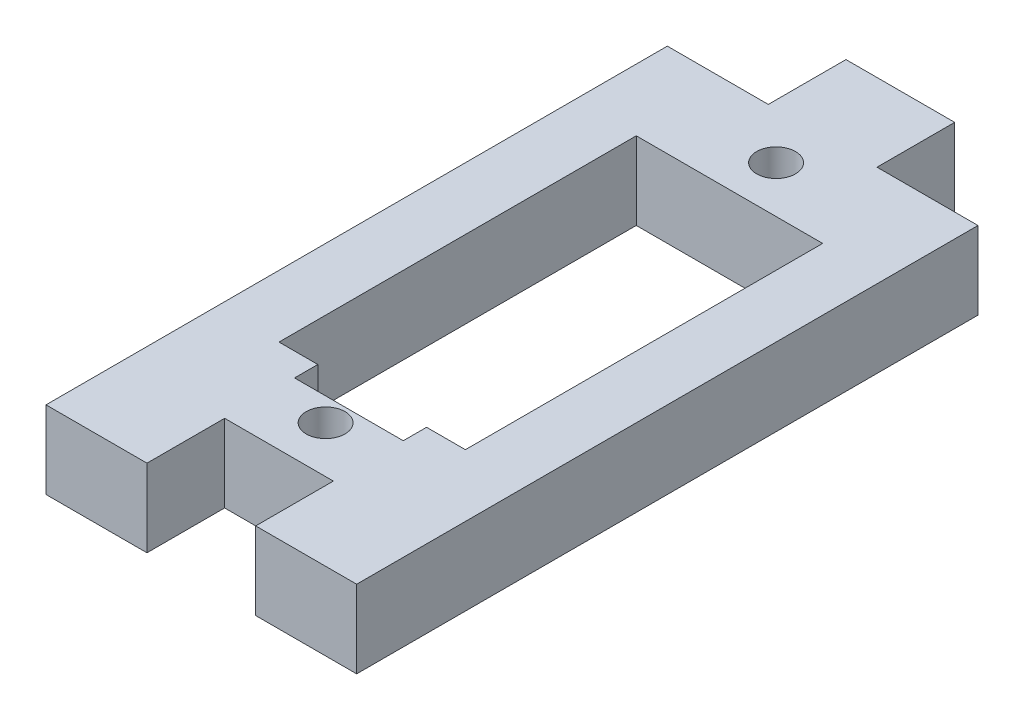
ISO-10303-21;
HEADER;
FILE_DESCRIPTION(('STEP AP214'),'2;1');
FILE_NAME('part.step','',(''),(''),'','','');
FILE_SCHEMA(('AUTOMOTIVE_DESIGN { 1 0 10303 214 1 1 1 1 }'));
ENDSEC;
DATA;
#1=APPLICATION_CONTEXT('core data for automotive mechanical design processes');
#2=APPLICATION_PROTOCOL_DEFINITION('international standard','automotive_design',2000,#1);
#3=PRODUCT_CONTEXT('',#1,'mechanical');
#4=PRODUCT('Part','Part','',(#3));
#5=PRODUCT_RELATED_PRODUCT_CATEGORY('part','',(#4));
#6=PRODUCT_DEFINITION_FORMATION('','',#4);
#7=PRODUCT_DEFINITION_CONTEXT('part definition',#1,'design');
#8=PRODUCT_DEFINITION('design','',#6,#7);
#9=PRODUCT_DEFINITION_SHAPE('','',#8);
#10=(LENGTH_UNIT() NAMED_UNIT(*) SI_UNIT(.MILLI.,.METRE.));
#11=(NAMED_UNIT(*) PLANE_ANGLE_UNIT() SI_UNIT($,.RADIAN.));
#12=(NAMED_UNIT(*) SI_UNIT($,.STERADIAN.) SOLID_ANGLE_UNIT());
#13=UNCERTAINTY_MEASURE_WITH_UNIT(LENGTH_MEASURE(1.E-05),#10,'distance_accuracy_value','');
#14=(GEOMETRIC_REPRESENTATION_CONTEXT(3) GLOBAL_UNCERTAINTY_ASSIGNED_CONTEXT((#13)) GLOBAL_UNIT_ASSIGNED_CONTEXT((#10,
#11,#12)) REPRESENTATION_CONTEXT('',''));
#15=CARTESIAN_POINT('',(0.,0.,0.));
#16=DIRECTION('',(0.,0.,1.));
#17=DIRECTION('',(1.,0.,0.));
#18=AXIS2_PLACEMENT_3D('',#15,#16,#17);
#19=CARTESIAN_POINT('',(-3.5,5.,-20.));
#20=DIRECTION('',(0.,0.,1.));
#21=DIRECTION('',(1.,0.,0.));
#22=AXIS2_PLACEMENT_3D('',#19,#20,#21);
#23=PLANE('',#22);
#24=DIRECTION('',(-1.,0.,0.));
#25=VECTOR('',#24,1.);
#26=CARTESIAN_POINT('',(-3.5,0.,-20.));
#27=LINE('',#26,#25);
#28=CARTESIAN_POINT('',(-3.5,0.,-20.));
#29=VERTEX_POINT('',#28);
#30=CARTESIAN_POINT('',(-10.,0.,-20.));
#31=VERTEX_POINT('',#30);
#32=EDGE_CURVE('E230',#29,#31,#27,.T.);
#33=ORIENTED_EDGE('',*,*,#32,.T.);
#34=DIRECTION('',(0.,-1.,0.));
#35=VECTOR('',#34,1.);
#36=CARTESIAN_POINT('',(-10.,5.,-20.));
#37=LINE('',#36,#35);
#38=CARTESIAN_POINT('',(-10.,5.,-20.));
#39=VERTEX_POINT('',#38);
#40=EDGE_CURVE('E11',#39,#31,#37,.T.);
#41=ORIENTED_EDGE('',*,*,#40,.F.);
#42=DIRECTION('',(-1.,0.,0.));
#43=VECTOR('',#42,1.);
#44=CARTESIAN_POINT('',(-3.5,5.,-20.));
#45=LINE('',#44,#43);
#46=CARTESIAN_POINT('',(-3.5,5.,-20.));
#47=VERTEX_POINT('',#46);
#48=EDGE_CURVE('E242',#47,#39,#45,.T.);
#49=ORIENTED_EDGE('',*,*,#48,.F.);
#50=DIRECTION('',(0.,-1.,0.));
#51=VECTOR('',#50,1.);
#52=CARTESIAN_POINT('',(-3.5,5.,-20.));
#53=LINE('',#52,#51);
#54=EDGE_CURVE('E268',#47,#29,#53,.T.);
#55=ORIENTED_EDGE('',*,*,#54,.T.);
#56=EDGE_LOOP('',(#33,#41,#49,#55));
#57=FACE_BOUND('',#56,.T.);
#58=ADVANCED_FACE('F33',(#57),#23,.F.);
#59=CARTESIAN_POINT('',(-10.,5.,-20.));
#60=DIRECTION('',(1.,0.,0.));
#61=DIRECTION('',(0.,0.,-1.));
#62=AXIS2_PLACEMENT_3D('',#59,#60,#61);
#63=PLANE('',#62);
#64=DIRECTION('',(0.,0.,1.));
#65=VECTOR('',#64,1.);
#66=CARTESIAN_POINT('',(-10.,0.,-20.));
#67=LINE('',#66,#65);
#68=CARTESIAN_POINT('',(-10.,0.,20.));
#69=VERTEX_POINT('',#68);
#70=EDGE_CURVE('E271',#31,#69,#67,.T.);
#71=ORIENTED_EDGE('',*,*,#70,.T.);
#72=DIRECTION('',(0.,-1.,0.));
#73=VECTOR('',#72,1.);
#74=CARTESIAN_POINT('',(-10.,5.,20.));
#75=LINE('',#74,#73);
#76=CARTESIAN_POINT('',(-10.,5.,20.));
#77=VERTEX_POINT('',#76);
#78=EDGE_CURVE('E40',#77,#69,#75,.T.);
#79=ORIENTED_EDGE('',*,*,#78,.F.);
#80=DIRECTION('',(0.,0.,1.));
#81=VECTOR('',#80,1.);
#82=CARTESIAN_POINT('',(-10.,5.,-20.));
#83=LINE('',#82,#81);
#84=EDGE_CURVE('E245',#39,#77,#83,.T.);
#85=ORIENTED_EDGE('',*,*,#84,.F.);
#86=ORIENTED_EDGE('',*,*,#40,.T.);
#87=EDGE_LOOP('',(#71,#79,#85,#86));
#88=FACE_BOUND('',#87,.T.);
#89=ADVANCED_FACE('F346',(#88),#63,.F.);
#90=CARTESIAN_POINT('',(-10.,5.,20.));
#91=DIRECTION('',(0.,0.,-1.));
#92=DIRECTION('',(-1.,0.,0.));
#93=AXIS2_PLACEMENT_3D('',#90,#91,#92);
#94=PLANE('',#93);
#95=DIRECTION('',(1.,0.,0.));
#96=VECTOR('',#95,1.);
#97=CARTESIAN_POINT('',(-10.,0.,20.));
#98=LINE('',#97,#96);
#99=CARTESIAN_POINT('',(-3.5,0.,20.));
#100=VERTEX_POINT('',#99);
#101=EDGE_CURVE('E273',#69,#100,#98,.T.);
#102=ORIENTED_EDGE('',*,*,#101,.T.);
#103=DIRECTION('',(0.,-1.,0.));
#104=VECTOR('',#103,1.);
#105=CARTESIAN_POINT('',(-3.5,5.,20.));
#106=LINE('',#105,#104);
#107=CARTESIAN_POINT('',(-3.5,5.,20.));
#108=VERTEX_POINT('',#107);
#109=EDGE_CURVE('E318',#108,#100,#106,.T.);
#110=ORIENTED_EDGE('',*,*,#109,.F.);
#111=DIRECTION('',(1.,0.,0.));
#112=VECTOR('',#111,1.);
#113=CARTESIAN_POINT('',(-10.,5.,20.));
#114=LINE('',#113,#112);
#115=EDGE_CURVE('E248',#77,#108,#114,.T.);
#116=ORIENTED_EDGE('',*,*,#115,.F.);
#117=ORIENTED_EDGE('',*,*,#78,.T.);
#118=EDGE_LOOP('',(#102,#110,#116,#117));
#119=FACE_BOUND('',#118,.T.);
#120=ADVANCED_FACE('F325',(#119),#94,.F.);
#121=CARTESIAN_POINT('',(-3.5,5.,20.));
#122=DIRECTION('',(-1.,0.,0.));
#123=DIRECTION('',(0.,0.,1.));
#124=AXIS2_PLACEMENT_3D('',#121,#122,#123);
#125=PLANE('',#124);
#126=DIRECTION('',(0.,0.,-1.));
#127=VECTOR('',#126,1.);
#128=CARTESIAN_POINT('',(-3.5,0.,20.));
#129=LINE('',#128,#127);
#130=CARTESIAN_POINT('',(-3.5,0.,15.));
#131=VERTEX_POINT('',#130);
#132=EDGE_CURVE('E275',#100,#131,#129,.T.);
#133=ORIENTED_EDGE('',*,*,#132,.T.);
#134=DIRECTION('',(0.,-1.,0.));
#135=VECTOR('',#134,1.);
#136=CARTESIAN_POINT('',(-3.5,5.,15.));
#137=LINE('',#136,#135);
#138=CARTESIAN_POINT('',(-3.5,5.,15.));
#139=VERTEX_POINT('',#138);
#140=EDGE_CURVE('E315',#139,#131,#137,.T.);
#141=ORIENTED_EDGE('',*,*,#140,.F.);
#142=DIRECTION('',(0.,0.,-1.));
#143=VECTOR('',#142,1.);
#144=CARTESIAN_POINT('',(-3.5,5.,20.));
#145=LINE('',#144,#143);
#146=EDGE_CURVE('E250',#108,#139,#145,.T.);
#147=ORIENTED_EDGE('',*,*,#146,.F.);
#148=ORIENTED_EDGE('',*,*,#109,.T.);
#149=EDGE_LOOP('',(#133,#141,#147,#148));
#150=FACE_BOUND('',#149,.T.);
#151=ADVANCED_FACE('F334',(#150),#125,.F.);
#152=CARTESIAN_POINT('',(-3.5,5.,15.));
#153=DIRECTION('',(0.,0.,-1.));
#154=DIRECTION('',(-1.,0.,0.));
#155=AXIS2_PLACEMENT_3D('',#152,#153,#154);
#156=PLANE('',#155);
#157=DIRECTION('',(1.,0.,0.));
#158=VECTOR('',#157,1.);
#159=CARTESIAN_POINT('',(-3.5,0.,15.));
#160=LINE('',#159,#158);
#161=CARTESIAN_POINT('',(3.5,0.,15.));
#162=VERTEX_POINT('',#161);
#163=EDGE_CURVE('E277',#131,#162,#160,.T.);
#164=ORIENTED_EDGE('',*,*,#163,.T.);
#165=DIRECTION('',(0.,-1.,0.));
#166=VECTOR('',#165,1.);
#167=CARTESIAN_POINT('',(3.5,5.,15.));
#168=LINE('',#167,#166);
#169=CARTESIAN_POINT('',(3.5,5.,15.));
#170=VERTEX_POINT('',#169);
#171=EDGE_CURVE('E312',#170,#162,#168,.T.);
#172=ORIENTED_EDGE('',*,*,#171,.F.);
#173=DIRECTION('',(1.,0.,0.));
#174=VECTOR('',#173,1.);
#175=CARTESIAN_POINT('',(-3.5,5.,15.));
#176=LINE('',#175,#174);
#177=EDGE_CURVE('E252',#139,#170,#176,.T.);
#178=ORIENTED_EDGE('',*,*,#177,.F.);
#179=ORIENTED_EDGE('',*,*,#140,.T.);
#180=EDGE_LOOP('',(#164,#172,#178,#179));
#181=FACE_BOUND('',#180,.T.);
#182=ADVANCED_FACE('F338',(#181),#156,.F.);
#183=CARTESIAN_POINT('',(3.5,5.,15.));
#184=DIRECTION('',(1.,0.,0.));
#185=DIRECTION('',(0.,0.,-1.));
#186=AXIS2_PLACEMENT_3D('',#183,#184,#185);
#187=PLANE('',#186);
#188=DIRECTION('',(0.,0.,1.));
#189=VECTOR('',#188,1.);
#190=CARTESIAN_POINT('',(3.5,0.,15.));
#191=LINE('',#190,#189);
#192=CARTESIAN_POINT('',(3.5,0.,20.));
#193=VERTEX_POINT('',#192);
#194=EDGE_CURVE('E279',#162,#193,#191,.T.);
#195=ORIENTED_EDGE('',*,*,#194,.T.);
#196=DIRECTION('',(0.,-1.,0.));
#197=VECTOR('',#196,1.);
#198=CARTESIAN_POINT('',(3.5,5.,20.));
#199=LINE('',#198,#197);
#200=CARTESIAN_POINT('',(3.5,5.,20.));
#201=VERTEX_POINT('',#200);
#202=EDGE_CURVE('E309',#201,#193,#199,.T.);
#203=ORIENTED_EDGE('',*,*,#202,.F.);
#204=DIRECTION('',(0.,0.,1.));
#205=VECTOR('',#204,1.);
#206=CARTESIAN_POINT('',(3.5,5.,15.));
#207=LINE('',#206,#205);
#208=EDGE_CURVE('E254',#170,#201,#207,.T.);
#209=ORIENTED_EDGE('',*,*,#208,.F.);
#210=ORIENTED_EDGE('',*,*,#171,.T.);
#211=EDGE_LOOP('',(#195,#203,#209,#210));
#212=FACE_BOUND('',#211,.T.);
#213=ADVANCED_FACE('F379',(#212),#187,.F.);
#214=CARTESIAN_POINT('',(3.5,5.,20.));
#215=DIRECTION('',(0.,0.,-1.));
#216=DIRECTION('',(-1.,0.,0.));
#217=AXIS2_PLACEMENT_3D('',#214,#215,#216);
#218=PLANE('',#217);
#219=DIRECTION('',(1.,0.,0.));
#220=VECTOR('',#219,1.);
#221=CARTESIAN_POINT('',(3.5,0.,20.));
#222=LINE('',#221,#220);
#223=CARTESIAN_POINT('',(10.,0.,20.));
#224=VERTEX_POINT('',#223);
#225=EDGE_CURVE('E281',#193,#224,#222,.T.);
#226=ORIENTED_EDGE('',*,*,#225,.T.);
#227=DIRECTION('',(0.,-1.,0.));
#228=VECTOR('',#227,1.);
#229=CARTESIAN_POINT('',(10.,5.,20.));
#230=LINE('',#229,#228);
#231=CARTESIAN_POINT('',(10.,5.,20.));
#232=VERTEX_POINT('',#231);
#233=EDGE_CURVE('E306',#232,#224,#230,.T.);
#234=ORIENTED_EDGE('',*,*,#233,.F.);
#235=DIRECTION('',(1.,0.,0.));
#236=VECTOR('',#235,1.);
#237=CARTESIAN_POINT('',(3.5,5.,20.));
#238=LINE('',#237,#236);
#239=EDGE_CURVE('E256',#201,#232,#238,.T.);
#240=ORIENTED_EDGE('',*,*,#239,.F.);
#241=ORIENTED_EDGE('',*,*,#202,.T.);
#242=EDGE_LOOP('',(#226,#234,#240,#241));
#243=FACE_BOUND('',#242,.T.);
#244=ADVANCED_FACE('F377',(#243),#218,.F.);
#245=CARTESIAN_POINT('',(10.,5.,20.));
#246=DIRECTION('',(-1.,0.,0.));
#247=DIRECTION('',(0.,0.,1.));
#248=AXIS2_PLACEMENT_3D('',#245,#246,#247);
#249=PLANE('',#248);
#250=DIRECTION('',(0.,0.,-1.));
#251=VECTOR('',#250,1.);
#252=CARTESIAN_POINT('',(10.,0.,20.));
#253=LINE('',#252,#251);
#254=CARTESIAN_POINT('',(10.,0.,-20.));
#255=VERTEX_POINT('',#254);
#256=EDGE_CURVE('E283',#224,#255,#253,.T.);
#257=ORIENTED_EDGE('',*,*,#256,.T.);
#258=DIRECTION('',(0.,-1.,0.));
#259=VECTOR('',#258,1.);
#260=CARTESIAN_POINT('',(10.,5.,-20.));
#261=LINE('',#260,#259);
#262=CARTESIAN_POINT('',(10.,5.,-20.));
#263=VERTEX_POINT('',#262);
#264=EDGE_CURVE('E303',#263,#255,#261,.T.);
#265=ORIENTED_EDGE('',*,*,#264,.F.);
#266=DIRECTION('',(0.,0.,-1.));
#267=VECTOR('',#266,1.);
#268=CARTESIAN_POINT('',(10.,5.,20.));
#269=LINE('',#268,#267);
#270=EDGE_CURVE('E258',#232,#263,#269,.T.);
#271=ORIENTED_EDGE('',*,*,#270,.F.);
#272=ORIENTED_EDGE('',*,*,#233,.T.);
#273=EDGE_LOOP('',(#257,#265,#271,#272));
#274=FACE_BOUND('',#273,.T.);
#275=ADVANCED_FACE('F373',(#274),#249,.F.);
#276=CARTESIAN_POINT('',(10.,5.,-20.));
#277=DIRECTION('',(0.,0.,1.));
#278=DIRECTION('',(1.,0.,0.));
#279=AXIS2_PLACEMENT_3D('',#276,#277,#278);
#280=PLANE('',#279);
#281=DIRECTION('',(-1.,0.,0.));
#282=VECTOR('',#281,1.);
#283=CARTESIAN_POINT('',(10.,0.,-20.));
#284=LINE('',#283,#282);
#285=CARTESIAN_POINT('',(3.5,0.,-20.));
#286=VERTEX_POINT('',#285);
#287=EDGE_CURVE('E285',#255,#286,#284,.T.);
#288=ORIENTED_EDGE('',*,*,#287,.T.);
#289=DIRECTION('',(0.,-1.,0.));
#290=VECTOR('',#289,1.);
#291=CARTESIAN_POINT('',(3.5,5.,-20.));
#292=LINE('',#291,#290);
#293=CARTESIAN_POINT('',(3.5,5.,-20.));
#294=VERTEX_POINT('',#293);
#295=EDGE_CURVE('E300',#294,#286,#292,.T.);
#296=ORIENTED_EDGE('',*,*,#295,.F.);
#297=DIRECTION('',(-1.,0.,0.));
#298=VECTOR('',#297,1.);
#299=CARTESIAN_POINT('',(10.,5.,-20.));
#300=LINE('',#299,#298);
#301=EDGE_CURVE('E260',#263,#294,#300,.T.);
#302=ORIENTED_EDGE('',*,*,#301,.F.);
#303=ORIENTED_EDGE('',*,*,#264,.T.);
#304=EDGE_LOOP('',(#288,#296,#302,#303));
#305=FACE_BOUND('',#304,.T.);
#306=ADVANCED_FACE('F368',(#305),#280,.F.);
#307=CARTESIAN_POINT('',(3.5,5.,-25.));
#308=DIRECTION('',(-1.,0.,0.));
#309=DIRECTION('',(0.,0.,1.));
#310=AXIS2_PLACEMENT_3D('',#307,#308,#309);
#311=PLANE('',#310);
#312=DIRECTION('',(0.,0.,-1.));
#313=VECTOR('',#312,1.);
#314=CARTESIAN_POINT('',(3.5,0.,-25.));
#315=LINE('',#314,#313);
#316=CARTESIAN_POINT('',(3.5,0.,-25.));
#317=VERTEX_POINT('',#316);
#318=EDGE_CURVE('E287',#286,#317,#315,.T.);
#319=ORIENTED_EDGE('',*,*,#318,.T.);
#320=DIRECTION('',(0.,-1.,0.));
#321=VECTOR('',#320,1.);
#322=CARTESIAN_POINT('',(3.5,5.,-25.));
#323=LINE('',#322,#321);
#324=CARTESIAN_POINT('',(3.5,5.,-25.));
#325=VERTEX_POINT('',#324);
#326=EDGE_CURVE('E297',#325,#317,#323,.T.);
#327=ORIENTED_EDGE('',*,*,#326,.F.);
#328=DIRECTION('',(0.,0.,-1.));
#329=VECTOR('',#328,1.);
#330=CARTESIAN_POINT('',(3.5,5.,-25.));
#331=LINE('',#330,#329);
#332=EDGE_CURVE('E262',#294,#325,#331,.T.);
#333=ORIENTED_EDGE('',*,*,#332,.F.);
#334=ORIENTED_EDGE('',*,*,#295,.T.);
#335=EDGE_LOOP('',(#319,#327,#333,#334));
#336=FACE_BOUND('',#335,.T.);
#337=ADVANCED_FACE('F362',(#336),#311,.F.);
#338=CARTESIAN_POINT('',(-3.5,5.,-25.));
#339=DIRECTION('',(0.,0.,1.));
#340=DIRECTION('',(1.,0.,0.));
#341=AXIS2_PLACEMENT_3D('',#338,#339,#340);
#342=PLANE('',#341);
#343=DIRECTION('',(-1.,0.,0.));
#344=VECTOR('',#343,1.);
#345=CARTESIAN_POINT('',(-3.5,0.,-25.));
#346=LINE('',#345,#344);
#347=CARTESIAN_POINT('',(-3.5,0.,-25.));
#348=VERTEX_POINT('',#347);
#349=EDGE_CURVE('E289',#317,#348,#346,.T.);
#350=ORIENTED_EDGE('',*,*,#349,.T.);
#351=DIRECTION('',(0.,-1.,0.));
#352=VECTOR('',#351,1.);
#353=CARTESIAN_POINT('',(-3.5,5.,-25.));
#354=LINE('',#353,#352);
#355=CARTESIAN_POINT('',(-3.5,5.,-25.));
#356=VERTEX_POINT('',#355);
#357=EDGE_CURVE('E294',#356,#348,#354,.T.);
#358=ORIENTED_EDGE('',*,*,#357,.F.);
#359=DIRECTION('',(-1.,0.,0.));
#360=VECTOR('',#359,1.);
#361=CARTESIAN_POINT('',(-3.5,5.,-25.));
#362=LINE('',#361,#360);
#363=EDGE_CURVE('E264',#325,#356,#362,.T.);
#364=ORIENTED_EDGE('',*,*,#363,.F.);
#365=ORIENTED_EDGE('',*,*,#326,.T.);
#366=EDGE_LOOP('',(#350,#358,#364,#365));
#367=FACE_BOUND('',#366,.T.);
#368=ADVANCED_FACE('F358',(#367),#342,.F.);
#369=CARTESIAN_POINT('',(-3.5,5.,-20.));
#370=DIRECTION('',(1.,0.,0.));
#371=DIRECTION('',(0.,0.,-1.));
#372=AXIS2_PLACEMENT_3D('',#369,#370,#371);
#373=PLANE('',#372);
#374=DIRECTION('',(0.,0.,1.));
#375=VECTOR('',#374,1.);
#376=CARTESIAN_POINT('',(-3.5,0.,-20.));
#377=LINE('',#376,#375);
#378=EDGE_CURVE('E246',#348,#29,#377,.T.);
#379=ORIENTED_EDGE('',*,*,#378,.T.);
#380=ORIENTED_EDGE('',*,*,#54,.F.);
#381=DIRECTION('',(0.,0.,1.));
#382=VECTOR('',#381,1.);
#383=CARTESIAN_POINT('',(-3.5,5.,-20.));
#384=LINE('',#383,#382);
#385=EDGE_CURVE('E266',#356,#47,#384,.T.);
#386=ORIENTED_EDGE('',*,*,#385,.F.);
#387=ORIENTED_EDGE('',*,*,#357,.T.);
#388=EDGE_LOOP('',(#379,#380,#386,#387));
#389=FACE_BOUND('',#388,.T.);
#390=ADVANCED_FACE('F353',(#389),#373,.F.);
#391=CARTESIAN_POINT('',(0.,5.,0.));
#392=DIRECTION('',(0.,1.,0.));
#393=DIRECTION('',(0.,0.,1.));
#394=AXIS2_PLACEMENT_3D('',#391,#392,#393);
#395=PLANE('',#394);
#396=CARTESIAN_POINT('',(0.,5.,12.));
#397=DIRECTION('',(0.,1.,0.));
#398=DIRECTION('',(0.,0.,1.));
#399=AXIS2_PLACEMENT_3D('',#396,#397,#398);
#400=CIRCLE('',#399,1.25);
#401=CARTESIAN_POINT('',(0.,5.,13.25));
#402=VERTEX_POINT('',#401);
#403=EDGE_CURVE('E194',#402,#402,#400,.T.);
#404=ORIENTED_EDGE('',*,*,#403,.F.);
#405=EDGE_LOOP('',(#404));
#406=FACE_BOUND('',#405,.T.);
#407=CARTESIAN_POINT('',(0.,5.,-17.));
#408=DIRECTION('',(0.,1.,0.));
#409=DIRECTION('',(0.,0.,1.));
#410=AXIS2_PLACEMENT_3D('',#407,#408,#409);
#411=CIRCLE('',#410,1.25);
#412=CARTESIAN_POINT('',(0.,5.,-15.75));
#413=VERTEX_POINT('',#412);
#414=EDGE_CURVE('E579',#413,#413,#411,.T.);
#415=ORIENTED_EDGE('',*,*,#414,.F.);
#416=EDGE_LOOP('',(#415));
#417=FACE_BOUND('',#416,.T.);
#418=DIRECTION('',(1.,0.,0.));
#419=VECTOR('',#418,1.);
#420=CARTESIAN_POINT('',(3.5,5.,9.));
#421=LINE('',#420,#419);
#422=CARTESIAN_POINT('',(3.5,5.,9.));
#423=VERTEX_POINT('',#422);
#424=CARTESIAN_POINT('',(6.,5.,9.));
#425=VERTEX_POINT('',#424);
#426=EDGE_CURVE('E47',#423,#425,#421,.T.);
#427=ORIENTED_EDGE('',*,*,#426,.F.);
#428=DIRECTION('',(0.,0.,-1.));
#429=VECTOR('',#428,1.);
#430=CARTESIAN_POINT('',(3.50000000000002,5.,10.5));
#431=LINE('',#430,#429);
#432=CARTESIAN_POINT('',(3.50000000000002,5.,10.5));
#433=VERTEX_POINT('',#432);
#434=EDGE_CURVE('E188',#433,#423,#431,.T.);
#435=ORIENTED_EDGE('',*,*,#434,.F.);
#436=DIRECTION('',(1.,0.,0.));
#437=VECTOR('',#436,1.);
#438=CARTESIAN_POINT('',(-3.5,5.,10.5));
#439=LINE('',#438,#437);
#440=CARTESIAN_POINT('',(-3.5,5.,10.5));
#441=VERTEX_POINT('',#440);
#442=EDGE_CURVE('E191',#441,#433,#439,.T.);
#443=ORIENTED_EDGE('',*,*,#442,.F.);
#444=DIRECTION('',(0.,0.,1.));
#445=VECTOR('',#444,1.);
#446=CARTESIAN_POINT('',(-3.5,5.,9.));
#447=LINE('',#446,#445);
#448=CARTESIAN_POINT('',(-3.5,5.,9.));
#449=VERTEX_POINT('',#448);
#450=EDGE_CURVE('E223',#449,#441,#447,.T.);
#451=ORIENTED_EDGE('',*,*,#450,.F.);
#452=DIRECTION('',(1.,0.,0.));
#453=VECTOR('',#452,1.);
#454=CARTESIAN_POINT('',(-6.,5.,9.));
#455=LINE('',#454,#453);
#456=CARTESIAN_POINT('',(-6.,5.,9.));
#457=VERTEX_POINT('',#456);
#458=EDGE_CURVE('E220',#457,#449,#455,.T.);
#459=ORIENTED_EDGE('',*,*,#458,.F.);
#460=DIRECTION('',(0.,0.,1.));
#461=VECTOR('',#460,1.);
#462=CARTESIAN_POINT('',(-6.,5.,-14.));
#463=LINE('',#462,#461);
#464=CARTESIAN_POINT('',(-6.,5.,-14.));
#465=VERTEX_POINT('',#464);
#466=EDGE_CURVE('E217',#465,#457,#463,.T.);
#467=ORIENTED_EDGE('',*,*,#466,.F.);
#468=DIRECTION('',(-1.,0.,0.));
#469=VECTOR('',#468,1.);
#470=CARTESIAN_POINT('',(-6.,5.,-14.));
#471=LINE('',#470,#469);
#472=CARTESIAN_POINT('',(6.,5.,-14.));
#473=VERTEX_POINT('',#472);
#474=EDGE_CURVE('E214',#473,#465,#471,.T.);
#475=ORIENTED_EDGE('',*,*,#474,.F.);
#476=DIRECTION('',(0.,0.,-1.));
#477=VECTOR('',#476,1.);
#478=CARTESIAN_POINT('',(6.,5.,-14.));
#479=LINE('',#478,#477);
#480=EDGE_CURVE('E211',#425,#473,#479,.T.);
#481=ORIENTED_EDGE('',*,*,#480,.F.);
#482=EDGE_LOOP('',(#427,#435,#443,#451,#459,#467,#475,#481));
#483=FACE_BOUND('',#482,.T.);
#484=ORIENTED_EDGE('',*,*,#48,.T.);
#485=ORIENTED_EDGE('',*,*,#84,.T.);
#486=ORIENTED_EDGE('',*,*,#115,.T.);
#487=ORIENTED_EDGE('',*,*,#146,.T.);
#488=ORIENTED_EDGE('',*,*,#177,.T.);
#489=ORIENTED_EDGE('',*,*,#208,.T.);
#490=ORIENTED_EDGE('',*,*,#239,.T.);
#491=ORIENTED_EDGE('',*,*,#270,.T.);
#492=ORIENTED_EDGE('',*,*,#301,.T.);
#493=ORIENTED_EDGE('',*,*,#332,.T.);
#494=ORIENTED_EDGE('',*,*,#363,.T.);
#495=ORIENTED_EDGE('',*,*,#385,.T.);
#496=EDGE_LOOP('',(#484,#485,#486,#487,#488,#489,#490,#491,#492,#493,#494,#495));
#497=FACE_BOUND('',#496,.T.);
#498=ADVANCED_FACE('F342',(#406,#417,#483,#497),#395,.T.);
#499=CARTESIAN_POINT('',(0.,0.,0.));
#500=DIRECTION('',(0.,1.,0.));
#501=DIRECTION('',(0.,0.,1.));
#502=AXIS2_PLACEMENT_3D('',#499,#500,#501);
#503=PLANE('',#502);
#504=CARTESIAN_POINT('',(0.,0.,12.));
#505=DIRECTION('',(0.,1.,0.));
#506=DIRECTION('',(0.,0.,1.));
#507=AXIS2_PLACEMENT_3D('',#504,#505,#506);
#508=CIRCLE('',#507,1.25);
#509=CARTESIAN_POINT('',(0.,0.,13.25));
#510=VERTEX_POINT('',#509);
#511=EDGE_CURVE('E576',#510,#510,#508,.T.);
#512=ORIENTED_EDGE('',*,*,#511,.T.);
#513=EDGE_LOOP('',(#512));
#514=FACE_BOUND('',#513,.T.);
#515=CARTESIAN_POINT('',(0.,0.,-17.));
#516=DIRECTION('',(0.,1.,0.));
#517=DIRECTION('',(0.,0.,1.));
#518=AXIS2_PLACEMENT_3D('',#515,#516,#517);
#519=CIRCLE('',#518,1.25);
#520=CARTESIAN_POINT('',(0.,0.,-15.75));
#521=VERTEX_POINT('',#520);
#522=EDGE_CURVE('E212',#521,#521,#519,.T.);
#523=ORIENTED_EDGE('',*,*,#522,.T.);
#524=EDGE_LOOP('',(#523));
#525=FACE_BOUND('',#524,.T.);
#526=DIRECTION('',(0.,0.,-1.));
#527=VECTOR('',#526,1.);
#528=CARTESIAN_POINT('',(3.50000000000002,0.,10.5));
#529=LINE('',#528,#527);
#530=CARTESIAN_POINT('',(3.50000000000002,0.,10.5));
#531=VERTEX_POINT('',#530);
#532=CARTESIAN_POINT('',(3.5,0.,9.));
#533=VERTEX_POINT('',#532);
#534=EDGE_CURVE('E177',#531,#533,#529,.T.);
#535=ORIENTED_EDGE('',*,*,#534,.T.);
#536=DIRECTION('',(1.,0.,0.));
#537=VECTOR('',#536,1.);
#538=CARTESIAN_POINT('',(3.5,0.,9.));
#539=LINE('',#538,#537);
#540=CARTESIAN_POINT('',(6.,0.,9.));
#541=VERTEX_POINT('',#540);
#542=EDGE_CURVE('E171',#533,#541,#539,.T.);
#543=ORIENTED_EDGE('',*,*,#542,.T.);
#544=DIRECTION('',(0.,0.,-1.));
#545=VECTOR('',#544,1.);
#546=CARTESIAN_POINT('',(6.,0.,-14.));
#547=LINE('',#546,#545);
#548=CARTESIAN_POINT('',(6.,0.,-14.));
#549=VERTEX_POINT('',#548);
#550=EDGE_CURVE('E180',#541,#549,#547,.T.);
#551=ORIENTED_EDGE('',*,*,#550,.T.);
#552=DIRECTION('',(-1.,0.,0.));
#553=VECTOR('',#552,1.);
#554=CARTESIAN_POINT('',(-6.,0.,-14.));
#555=LINE('',#554,#553);
#556=CARTESIAN_POINT('',(-6.,0.,-14.));
#557=VERTEX_POINT('',#556);
#558=EDGE_CURVE('E55',#549,#557,#555,.T.);
#559=ORIENTED_EDGE('',*,*,#558,.T.);
#560=DIRECTION('',(0.,0.,1.));
#561=VECTOR('',#560,1.);
#562=CARTESIAN_POINT('',(-6.,0.,-14.));
#563=LINE('',#562,#561);
#564=CARTESIAN_POINT('',(-6.,0.,9.));
#565=VERTEX_POINT('',#564);
#566=EDGE_CURVE('E198',#557,#565,#563,.T.);
#567=ORIENTED_EDGE('',*,*,#566,.T.);
#568=DIRECTION('',(1.,0.,0.));
#569=VECTOR('',#568,1.);
#570=CARTESIAN_POINT('',(-6.,0.,9.));
#571=LINE('',#570,#569);
#572=CARTESIAN_POINT('',(-3.5,0.,9.));
#573=VERTEX_POINT('',#572);
#574=EDGE_CURVE('E201',#565,#573,#571,.T.);
#575=ORIENTED_EDGE('',*,*,#574,.T.);
#576=DIRECTION('',(0.,0.,1.));
#577=VECTOR('',#576,1.);
#578=CARTESIAN_POINT('',(-3.5,0.,9.));
#579=LINE('',#578,#577);
#580=CARTESIAN_POINT('',(-3.5,0.,10.5));
#581=VERTEX_POINT('',#580);
#582=EDGE_CURVE('E204',#573,#581,#579,.T.);
#583=ORIENTED_EDGE('',*,*,#582,.T.);
#584=DIRECTION('',(1.,0.,0.));
#585=VECTOR('',#584,1.);
#586=CARTESIAN_POINT('',(-3.5,0.,10.5));
#587=LINE('',#586,#585);
#588=EDGE_CURVE('E207',#581,#531,#587,.T.);
#589=ORIENTED_EDGE('',*,*,#588,.T.);
#590=EDGE_LOOP('',(#535,#543,#551,#559,#567,#575,#583,#589));
#591=FACE_BOUND('',#590,.T.);
#592=ORIENTED_EDGE('',*,*,#32,.F.);
#593=ORIENTED_EDGE('',*,*,#378,.F.);
#594=ORIENTED_EDGE('',*,*,#349,.F.);
#595=ORIENTED_EDGE('',*,*,#318,.F.);
#596=ORIENTED_EDGE('',*,*,#287,.F.);
#597=ORIENTED_EDGE('',*,*,#256,.F.);
#598=ORIENTED_EDGE('',*,*,#225,.F.);
#599=ORIENTED_EDGE('',*,*,#194,.F.);
#600=ORIENTED_EDGE('',*,*,#163,.F.);
#601=ORIENTED_EDGE('',*,*,#132,.F.);
#602=ORIENTED_EDGE('',*,*,#101,.F.);
#603=ORIENTED_EDGE('',*,*,#70,.F.);
#604=EDGE_LOOP('',(#592,#593,#594,#595,#596,#597,#598,#599,#600,#601,#602,#603));
#605=FACE_BOUND('',#604,.T.);
#606=ADVANCED_FACE('F184',(#514,#525,#591,#605),#503,.F.);
#607=CARTESIAN_POINT('',(3.5,0.,9.));
#608=DIRECTION('',(0.,0.,1.));
#609=DIRECTION('',(1.,0.,0.));
#610=AXIS2_PLACEMENT_3D('',#607,#608,#609);
#611=PLANE('',#610);
#612=ORIENTED_EDGE('',*,*,#426,.T.);
#613=DIRECTION('',(0.,1.,0.));
#614=VECTOR('',#613,1.);
#615=CARTESIAN_POINT('',(6.,0.,9.));
#616=LINE('',#615,#614);
#617=EDGE_CURVE('E167',#541,#425,#616,.T.);
#618=ORIENTED_EDGE('',*,*,#617,.F.);
#619=ORIENTED_EDGE('',*,*,#542,.F.);
#620=DIRECTION('',(0.,1.,0.));
#621=VECTOR('',#620,1.);
#622=CARTESIAN_POINT('',(3.5,0.,9.));
#623=LINE('',#622,#621);
#624=EDGE_CURVE('E228',#533,#423,#623,.T.);
#625=ORIENTED_EDGE('',*,*,#624,.T.);
#626=EDGE_LOOP('',(#612,#618,#619,#625));
#627=FACE_BOUND('',#626,.T.);
#628=ADVANCED_FACE('F169',(#627),#611,.F.);
#629=CARTESIAN_POINT('',(3.50000000000002,0.,10.5));
#630=DIRECTION('',(1.,0.,0.));
#631=DIRECTION('',(0.,0.,-1.));
#632=AXIS2_PLACEMENT_3D('',#629,#630,#631);
#633=PLANE('',#632);
#634=ORIENTED_EDGE('',*,*,#434,.T.);
#635=ORIENTED_EDGE('',*,*,#624,.F.);
#636=ORIENTED_EDGE('',*,*,#534,.F.);
#637=DIRECTION('',(0.,1.,0.));
#638=VECTOR('',#637,1.);
#639=CARTESIAN_POINT('',(3.50000000000002,0.,10.5));
#640=LINE('',#639,#638);
#641=EDGE_CURVE('E231',#531,#433,#640,.T.);
#642=ORIENTED_EDGE('',*,*,#641,.T.);
#643=EDGE_LOOP('',(#634,#635,#636,#642));
#644=FACE_BOUND('',#643,.T.);
#645=ADVANCED_FACE('F483',(#644),#633,.F.);
#646=CARTESIAN_POINT('',(-3.5,0.,10.5));
#647=DIRECTION('',(0.,0.,1.));
#648=DIRECTION('',(1.,0.,0.));
#649=AXIS2_PLACEMENT_3D('',#646,#647,#648);
#650=PLANE('',#649);
#651=ORIENTED_EDGE('',*,*,#442,.T.);
#652=ORIENTED_EDGE('',*,*,#641,.F.);
#653=ORIENTED_EDGE('',*,*,#588,.F.);
#654=DIRECTION('',(0.,1.,0.));
#655=VECTOR('',#654,1.);
#656=CARTESIAN_POINT('',(-3.5,0.,10.5));
#657=LINE('',#656,#655);
#658=EDGE_CURVE('E233',#581,#441,#657,.T.);
#659=ORIENTED_EDGE('',*,*,#658,.T.);
#660=EDGE_LOOP('',(#651,#652,#653,#659));
#661=FACE_BOUND('',#660,.T.);
#662=ADVANCED_FACE('F492',(#661),#650,.F.);
#663=CARTESIAN_POINT('',(-3.5,0.,9.));
#664=DIRECTION('',(-1.,0.,0.));
#665=DIRECTION('',(0.,0.,1.));
#666=AXIS2_PLACEMENT_3D('',#663,#664,#665);
#667=PLANE('',#666);
#668=ORIENTED_EDGE('',*,*,#450,.T.);
#669=ORIENTED_EDGE('',*,*,#658,.F.);
#670=ORIENTED_EDGE('',*,*,#582,.F.);
#671=DIRECTION('',(0.,1.,0.));
#672=VECTOR('',#671,1.);
#673=CARTESIAN_POINT('',(-3.5,0.,9.));
#674=LINE('',#673,#672);
#675=EDGE_CURVE('E235',#573,#449,#674,.T.);
#676=ORIENTED_EDGE('',*,*,#675,.T.);
#677=EDGE_LOOP('',(#668,#669,#670,#676));
#678=FACE_BOUND('',#677,.T.);
#679=ADVANCED_FACE('F502',(#678),#667,.F.);
#680=CARTESIAN_POINT('',(-6.,0.,9.));
#681=DIRECTION('',(0.,0.,1.));
#682=DIRECTION('',(1.,0.,0.));
#683=AXIS2_PLACEMENT_3D('',#680,#681,#682);
#684=PLANE('',#683);
#685=ORIENTED_EDGE('',*,*,#458,.T.);
#686=ORIENTED_EDGE('',*,*,#675,.F.);
#687=ORIENTED_EDGE('',*,*,#574,.F.);
#688=DIRECTION('',(0.,1.,0.));
#689=VECTOR('',#688,1.);
#690=CARTESIAN_POINT('',(-6.,0.,9.));
#691=LINE('',#690,#689);
#692=EDGE_CURVE('E237',#565,#457,#691,.T.);
#693=ORIENTED_EDGE('',*,*,#692,.T.);
#694=EDGE_LOOP('',(#685,#686,#687,#693));
#695=FACE_BOUND('',#694,.T.);
#696=ADVANCED_FACE('F512',(#695),#684,.F.);
#697=CARTESIAN_POINT('',(-6.,0.,-14.));
#698=DIRECTION('',(-1.,0.,0.));
#699=DIRECTION('',(0.,0.,1.));
#700=AXIS2_PLACEMENT_3D('',#697,#698,#699);
#701=PLANE('',#700);
#702=ORIENTED_EDGE('',*,*,#466,.T.);
#703=ORIENTED_EDGE('',*,*,#692,.F.);
#704=ORIENTED_EDGE('',*,*,#566,.F.);
#705=DIRECTION('',(0.,1.,0.));
#706=VECTOR('',#705,1.);
#707=CARTESIAN_POINT('',(-6.,0.,-14.));
#708=LINE('',#707,#706);
#709=EDGE_CURVE('E239',#557,#465,#708,.T.);
#710=ORIENTED_EDGE('',*,*,#709,.T.);
#711=EDGE_LOOP('',(#702,#703,#704,#710));
#712=FACE_BOUND('',#711,.T.);
#713=ADVANCED_FACE('F522',(#712),#701,.F.);
#714=CARTESIAN_POINT('',(-6.,0.,-14.));
#715=DIRECTION('',(0.,0.,-1.));
#716=DIRECTION('',(-1.,0.,0.));
#717=AXIS2_PLACEMENT_3D('',#714,#715,#716);
#718=PLANE('',#717);
#719=ORIENTED_EDGE('',*,*,#474,.T.);
#720=ORIENTED_EDGE('',*,*,#709,.F.);
#721=ORIENTED_EDGE('',*,*,#558,.F.);
#722=DIRECTION('',(0.,1.,0.));
#723=VECTOR('',#722,1.);
#724=CARTESIAN_POINT('',(6.,0.,-14.));
#725=LINE('',#724,#723);
#726=EDGE_CURVE('E176',#549,#473,#725,.T.);
#727=ORIENTED_EDGE('',*,*,#726,.T.);
#728=EDGE_LOOP('',(#719,#720,#721,#727));
#729=FACE_BOUND('',#728,.T.);
#730=ADVANCED_FACE('F532',(#729),#718,.F.);
#731=CARTESIAN_POINT('',(6.,0.,-14.));
#732=DIRECTION('',(1.,0.,0.));
#733=DIRECTION('',(0.,0.,-1.));
#734=AXIS2_PLACEMENT_3D('',#731,#732,#733);
#735=PLANE('',#734);
#736=ORIENTED_EDGE('',*,*,#480,.T.);
#737=ORIENTED_EDGE('',*,*,#726,.F.);
#738=ORIENTED_EDGE('',*,*,#550,.F.);
#739=ORIENTED_EDGE('',*,*,#617,.T.);
#740=EDGE_LOOP('',(#736,#737,#738,#739));
#741=FACE_BOUND('',#740,.T.);
#742=ADVANCED_FACE('F181',(#741),#735,.F.);
#743=CARTESIAN_POINT('',(0.,0.,-17.));
#744=DIRECTION('',(0.,1.,0.));
#745=DIRECTION('',(0.,0.,1.));
#746=AXIS2_PLACEMENT_3D('',#743,#744,#745);
#747=CYLINDRICAL_SURFACE('',#746,1.25);
#748=ORIENTED_EDGE('',*,*,#522,.F.);
#749=EDGE_LOOP('',(#748));
#750=FACE_BOUND('',#749,.T.);
#751=ORIENTED_EDGE('',*,*,#414,.T.);
#752=EDGE_LOOP('',(#751));
#753=FACE_BOUND('',#752,.T.);
#754=ADVANCED_FACE('F550',(#750,#753),#747,.F.);
#755=CARTESIAN_POINT('',(0.,0.,12.));
#756=DIRECTION('',(0.,1.,0.));
#757=DIRECTION('',(0.,0.,1.));
#758=AXIS2_PLACEMENT_3D('',#755,#756,#757);
#759=CYLINDRICAL_SURFACE('',#758,1.25);
#760=ORIENTED_EDGE('',*,*,#511,.F.);
#761=EDGE_LOOP('',(#760));
#762=FACE_BOUND('',#761,.T.);
#763=ORIENTED_EDGE('',*,*,#403,.T.);
#764=EDGE_LOOP('',(#763));
#765=FACE_BOUND('',#764,.T.);
#766=ADVANCED_FACE('F559',(#762,#765),#759,.F.);
#767=CLOSED_SHELL('',(#58,#89,#120,#151,#182,#213,#244,#275,#306,#337,#368,#390,#498,#606,#628,
#645,#662,#679,#696,#713,#730,#742,#754,#766));
#768=MANIFOLD_SOLID_BREP('B2',#767);
#769=ADVANCED_BREP_SHAPE_REPRESENTATION('',(#18,#768),#14);
#770=SHAPE_DEFINITION_REPRESENTATION(#9,#769);
ENDSEC;
END-ISO-10303-21;
